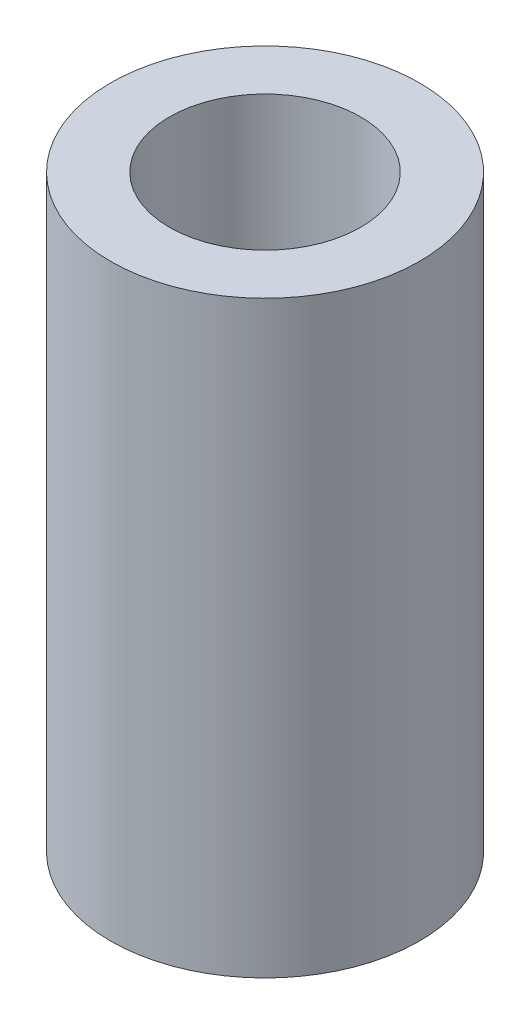
ISO-10303-21;
HEADER;
FILE_DESCRIPTION(('STEP AP214'),'2;1');
FILE_NAME('part.step','',(''),(''),'','','');
FILE_SCHEMA(('AUTOMOTIVE_DESIGN { 1 0 10303 214 1 1 1 1 }'));
ENDSEC;
DATA;
#1=APPLICATION_CONTEXT('core data for automotive mechanical design processes');
#2=APPLICATION_PROTOCOL_DEFINITION('international standard','automotive_design',2000,#1);
#3=PRODUCT_CONTEXT('',#1,'mechanical');
#4=PRODUCT('Part','Part','',(#3));
#5=PRODUCT_RELATED_PRODUCT_CATEGORY('part','',(#4));
#6=PRODUCT_DEFINITION_FORMATION('','',#4);
#7=PRODUCT_DEFINITION_CONTEXT('part definition',#1,'design');
#8=PRODUCT_DEFINITION('design','',#6,#7);
#9=PRODUCT_DEFINITION_SHAPE('','',#8);
#10=(LENGTH_UNIT() NAMED_UNIT(*) SI_UNIT(.MILLI.,.METRE.));
#11=(NAMED_UNIT(*) PLANE_ANGLE_UNIT() SI_UNIT($,.RADIAN.));
#12=(NAMED_UNIT(*) SI_UNIT($,.STERADIAN.) SOLID_ANGLE_UNIT());
#13=UNCERTAINTY_MEASURE_WITH_UNIT(LENGTH_MEASURE(1.E-05),#10,'distance_accuracy_value','');
#14=(GEOMETRIC_REPRESENTATION_CONTEXT(3) GLOBAL_UNCERTAINTY_ASSIGNED_CONTEXT((#13)) GLOBAL_UNIT_ASSIGNED_CONTEXT((#10,
#11,#12)) REPRESENTATION_CONTEXT('',''));
#15=CARTESIAN_POINT('',(0.,0.,0.));
#16=DIRECTION('',(0.,0.,1.));
#17=DIRECTION('',(1.,0.,0.));
#18=AXIS2_PLACEMENT_3D('',#15,#16,#17);
#19=CARTESIAN_POINT('',(0.,20.,0.104032487832023));
#20=DIRECTION('',(0.,1.,0.));
#21=DIRECTION('',(0.,0.,1.));
#22=AXIS2_PLACEMENT_3D('',#19,#20,#21);
#23=PLANE('',#22);
#24=CARTESIAN_POINT('',(0.,20.,0.104032487832023));
#25=DIRECTION('',(0.,1.,0.));
#26=DIRECTION('',(0.,0.,1.));
#27=AXIS2_PLACEMENT_3D('',#24,#25,#26);
#28=CIRCLE('',#27,5.25);
#29=CARTESIAN_POINT('',(0.,20.,5.35403248783202));
#30=VERTEX_POINT('',#29);
#31=EDGE_CURVE('E10',#30,#30,#28,.T.);
#32=ORIENTED_EDGE('',*,*,#31,.T.);
#33=EDGE_LOOP('',(#32));
#34=FACE_BOUND('',#33,.T.);
#35=CARTESIAN_POINT('',(0.,20.,0.104032487832023));
#36=DIRECTION('',(0.,1.,0.));
#37=DIRECTION('',(0.,0.,1.));
#38=AXIS2_PLACEMENT_3D('',#35,#36,#37);
#39=CIRCLE('',#38,3.25);
#40=CARTESIAN_POINT('',(0.,20.,3.35403248783202));
#41=VERTEX_POINT('',#40);
#42=EDGE_CURVE('E50',#41,#41,#39,.T.);
#43=ORIENTED_EDGE('',*,*,#42,.F.);
#44=EDGE_LOOP('',(#43));
#45=FACE_BOUND('',#44,.T.);
#46=ADVANCED_FACE('F37',(#34,#45),#23,.T.);
#47=CARTESIAN_POINT('',(0.,0.,0.104032487832023));
#48=DIRECTION('',(0.,1.,0.));
#49=DIRECTION('',(0.,0.,1.));
#50=AXIS2_PLACEMENT_3D('',#47,#48,#49);
#51=PLANE('',#50);
#52=CARTESIAN_POINT('',(0.,0.,0.104032487832023));
#53=DIRECTION('',(0.,1.,0.));
#54=DIRECTION('',(0.,0.,1.));
#55=AXIS2_PLACEMENT_3D('',#52,#53,#54);
#56=CIRCLE('',#55,5.25);
#57=CARTESIAN_POINT('',(0.,0.,5.35403248783202));
#58=VERTEX_POINT('',#57);
#59=EDGE_CURVE('E41',#58,#58,#56,.T.);
#60=ORIENTED_EDGE('',*,*,#59,.F.);
#61=EDGE_LOOP('',(#60));
#62=FACE_BOUND('',#61,.T.);
#63=CARTESIAN_POINT('',(0.,0.,0.104032487832023));
#64=DIRECTION('',(0.,1.,0.));
#65=DIRECTION('',(0.,0.,1.));
#66=AXIS2_PLACEMENT_3D('',#63,#64,#65);
#67=CIRCLE('',#66,3.25);
#68=CARTESIAN_POINT('',(0.,0.,3.35403248783202));
#69=VERTEX_POINT('',#68);
#70=EDGE_CURVE('E52',#69,#69,#67,.T.);
#71=ORIENTED_EDGE('',*,*,#70,.T.);
#72=EDGE_LOOP('',(#71));
#73=FACE_BOUND('',#72,.T.);
#74=ADVANCED_FACE('F64',(#62,#73),#51,.F.);
#75=CARTESIAN_POINT('',(0.,20.,0.104032487832023));
#76=DIRECTION('',(0.,-1.,0.));
#77=DIRECTION('',(0.,0.,-1.));
#78=AXIS2_PLACEMENT_3D('',#75,#76,#77);
#79=CYLINDRICAL_SURFACE('',#78,5.25);
#80=ORIENTED_EDGE('',*,*,#31,.F.);
#81=EDGE_LOOP('',(#80));
#82=FACE_BOUND('',#81,.T.);
#83=ORIENTED_EDGE('',*,*,#59,.T.);
#84=EDGE_LOOP('',(#83));
#85=FACE_BOUND('',#84,.T.);
#86=ADVANCED_FACE('F39',(#82,#85),#79,.T.);
#87=CARTESIAN_POINT('',(0.,20.,0.104032487832023));
#88=DIRECTION('',(0.,-1.,0.));
#89=DIRECTION('',(0.,0.,-1.));
#90=AXIS2_PLACEMENT_3D('',#87,#88,#89);
#91=CYLINDRICAL_SURFACE('',#90,3.25);
#92=ORIENTED_EDGE('',*,*,#42,.T.);
#93=EDGE_LOOP('',(#92));
#94=FACE_BOUND('',#93,.T.);
#95=ORIENTED_EDGE('',*,*,#70,.F.);
#96=EDGE_LOOP('',(#95));
#97=FACE_BOUND('',#96,.T.);
#98=ADVANCED_FACE('F60',(#94,#97),#91,.F.);
#99=CLOSED_SHELL('',(#46,#74,#86,#98));
#100=MANIFOLD_SOLID_BREP('B2',#99);
#101=ADVANCED_BREP_SHAPE_REPRESENTATION('',(#18,#100),#14);
#102=SHAPE_DEFINITION_REPRESENTATION(#9,#101);
ENDSEC;
END-ISO-10303-21;
